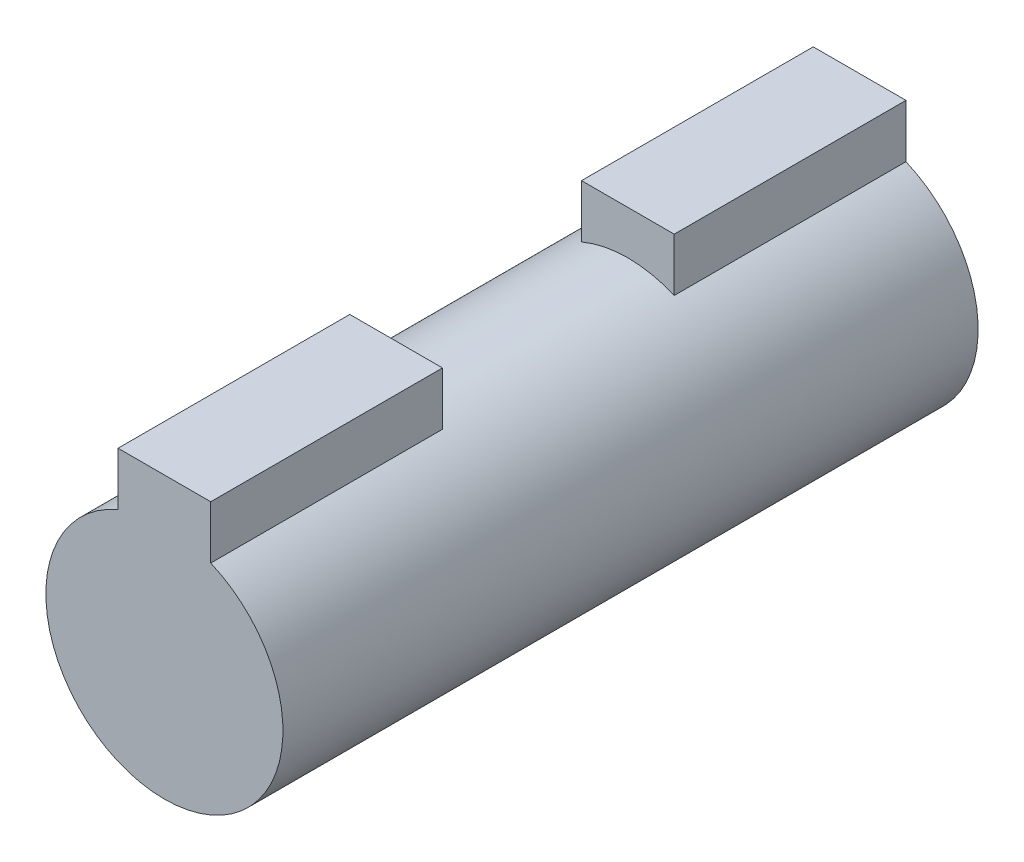
ISO-10303-21;
HEADER;
FILE_DESCRIPTION(('STEP AP214'),'2;1');
FILE_NAME('part.step','',(''),(''),'','','');
FILE_SCHEMA(('AUTOMOTIVE_DESIGN { 1 0 10303 214 1 1 1 1 }'));
ENDSEC;
DATA;
#1=APPLICATION_CONTEXT('core data for automotive mechanical design processes');
#2=APPLICATION_PROTOCOL_DEFINITION('international standard','automotive_design',2000,#1);
#3=PRODUCT_CONTEXT('',#1,'mechanical');
#4=PRODUCT('Part','Part','',(#3));
#5=PRODUCT_RELATED_PRODUCT_CATEGORY('part','',(#4));
#6=PRODUCT_DEFINITION_FORMATION('','',#4);
#7=PRODUCT_DEFINITION_CONTEXT('part definition',#1,'design');
#8=PRODUCT_DEFINITION('design','',#6,#7);
#9=PRODUCT_DEFINITION_SHAPE('','',#8);
#10=(LENGTH_UNIT() NAMED_UNIT(*) SI_UNIT(.MILLI.,.METRE.));
#11=(NAMED_UNIT(*) PLANE_ANGLE_UNIT() SI_UNIT($,.RADIAN.));
#12=(NAMED_UNIT(*) SI_UNIT($,.STERADIAN.) SOLID_ANGLE_UNIT());
#13=UNCERTAINTY_MEASURE_WITH_UNIT(LENGTH_MEASURE(1.E-05),#10,'distance_accuracy_value','');
#14=(GEOMETRIC_REPRESENTATION_CONTEXT(3) GLOBAL_UNCERTAINTY_ASSIGNED_CONTEXT((#13)) GLOBAL_UNIT_ASSIGNED_CONTEXT((#10,
#11,#12)) REPRESENTATION_CONTEXT('',''));
#15=CARTESIAN_POINT('',(0.,0.,0.));
#16=DIRECTION('',(0.,0.,1.));
#17=DIRECTION('',(1.,0.,0.));
#18=AXIS2_PLACEMENT_3D('',#15,#16,#17);
#19=CARTESIAN_POINT('',(-2.,7.,30.));
#20=DIRECTION('',(1.,0.,0.));
#21=DIRECTION('',(0.,1.,0.));
#22=AXIS2_PLACEMENT_3D('',#19,#20,#21);
#23=PLANE('',#22);
#24=DIRECTION('',(0.,-1.,0.));
#25=VECTOR('',#24,1.);
#26=CARTESIAN_POINT('',(-2.,7.,9.99999999999999));
#27=LINE('',#26,#25);
#28=CARTESIAN_POINT('',(-2.,7.,9.99999999999999));
#29=VERTEX_POINT('',#28);
#30=CARTESIAN_POINT('',(-2.,4.70778344871554,10.));
#31=VERTEX_POINT('',#30);
#32=EDGE_CURVE('E157',#29,#31,#27,.T.);
#33=ORIENTED_EDGE('',*,*,#32,.F.);
#34=DIRECTION('',(0.,0.,-1.));
#35=VECTOR('',#34,1.);
#36=CARTESIAN_POINT('',(-2.,7.,30.));
#37=LINE('',#36,#35);
#38=CARTESIAN_POINT('',(-2.,7.,0.));
#39=VERTEX_POINT('',#38);
#40=EDGE_CURVE('E85',#29,#39,#37,.T.);
#41=ORIENTED_EDGE('',*,*,#40,.T.);
#42=DIRECTION('',(0.,-1.,0.));
#43=VECTOR('',#42,1.);
#44=CARTESIAN_POINT('',(-2.,7.,0.));
#45=LINE('',#44,#43);
#46=CARTESIAN_POINT('',(-2.,4.70778344871554,0.));
#47=VERTEX_POINT('',#46);
#48=EDGE_CURVE('E155',#39,#47,#45,.T.);
#49=ORIENTED_EDGE('',*,*,#48,.T.);
#50=DIRECTION('',(0.,0.,-1.));
#51=VECTOR('',#50,1.);
#52=CARTESIAN_POINT('',(-2.,4.70778344871554,30.));
#53=LINE('',#52,#51);
#54=EDGE_CURVE('E131',#31,#47,#53,.T.);
#55=ORIENTED_EDGE('',*,*,#54,.F.);
#56=EDGE_LOOP('',(#33,#41,#49,#55));
#57=FACE_BOUND('',#56,.T.);
#58=ADVANCED_FACE('F39',(#57),#23,.F.);
#59=CARTESIAN_POINT('',(2.,7.,30.));
#60=DIRECTION('',(-1.,0.,0.));
#61=DIRECTION('',(0.,-1.,0.));
#62=AXIS2_PLACEMENT_3D('',#59,#60,#61);
#63=PLANE('',#62);
#64=DIRECTION('',(0.,1.,0.));
#65=VECTOR('',#64,1.);
#66=CARTESIAN_POINT('',(2.,7.,9.99999999999999));
#67=LINE('',#66,#65);
#68=CARTESIAN_POINT('',(2.,4.70778344871554,10.));
#69=VERTEX_POINT('',#68);
#70=CARTESIAN_POINT('',(2.,7.,9.99999999999999));
#71=VERTEX_POINT('',#70);
#72=EDGE_CURVE('E163',#69,#71,#67,.T.);
#73=ORIENTED_EDGE('',*,*,#72,.F.);
#74=DIRECTION('',(0.,0.,-1.));
#75=VECTOR('',#74,1.);
#76=CARTESIAN_POINT('',(2.,4.70778344871554,30.));
#77=LINE('',#76,#75);
#78=CARTESIAN_POINT('',(2.,4.70778344871554,0.));
#79=VERTEX_POINT('',#78);
#80=EDGE_CURVE('E132',#69,#79,#77,.T.);
#81=ORIENTED_EDGE('',*,*,#80,.T.);
#82=DIRECTION('',(0.,1.,0.));
#83=VECTOR('',#82,1.);
#84=CARTESIAN_POINT('',(2.,7.,0.));
#85=LINE('',#84,#83);
#86=CARTESIAN_POINT('',(2.,7.,0.));
#87=VERTEX_POINT('',#86);
#88=EDGE_CURVE('E149',#79,#87,#85,.T.);
#89=ORIENTED_EDGE('',*,*,#88,.T.);
#90=DIRECTION('',(0.,0.,-1.));
#91=VECTOR('',#90,1.);
#92=CARTESIAN_POINT('',(2.,7.,30.));
#93=LINE('',#92,#91);
#94=EDGE_CURVE('E145',#71,#87,#93,.T.);
#95=ORIENTED_EDGE('',*,*,#94,.F.);
#96=EDGE_LOOP('',(#73,#81,#89,#95));
#97=FACE_BOUND('',#96,.T.);
#98=ADVANCED_FACE('F179',(#97),#63,.F.);
#99=CARTESIAN_POINT('',(-2.,7.,30.));
#100=DIRECTION('',(0.,-1.,0.));
#101=DIRECTION('',(0.,0.,-1.));
#102=AXIS2_PLACEMENT_3D('',#99,#100,#101);
#103=PLANE('',#102);
#104=DIRECTION('',(-1.,0.,0.));
#105=VECTOR('',#104,1.);
#106=CARTESIAN_POINT('',(-2.,7.,9.99999999999999));
#107=LINE('',#106,#105);
#108=EDGE_CURVE('E11',#71,#29,#107,.T.);
#109=ORIENTED_EDGE('',*,*,#108,.F.);
#110=ORIENTED_EDGE('',*,*,#94,.T.);
#111=DIRECTION('',(-1.,0.,0.));
#112=VECTOR('',#111,1.);
#113=CARTESIAN_POINT('',(-2.,7.,0.));
#114=LINE('',#113,#112);
#115=EDGE_CURVE('E147',#87,#39,#114,.T.);
#116=ORIENTED_EDGE('',*,*,#115,.T.);
#117=ORIENTED_EDGE('',*,*,#40,.F.);
#118=EDGE_LOOP('',(#109,#110,#116,#117));
#119=FACE_BOUND('',#118,.T.);
#120=ADVANCED_FACE('F183',(#119),#103,.F.);
#121=CARTESIAN_POINT('',(-2.,7.,30.));
#122=VERTEX_POINT('',#121);
#123=CARTESIAN_POINT('',(-2.,7.,20.));
#124=VERTEX_POINT('',#123);
#125=EDGE_CURVE('E141',#122,#124,#37,.T.);
#126=ORIENTED_EDGE('',*,*,#125,.T.);
#127=DIRECTION('',(0.,-1.,0.));
#128=VECTOR('',#127,1.);
#129=CARTESIAN_POINT('',(-2.,7.,20.));
#130=LINE('',#129,#128);
#131=CARTESIAN_POINT('',(-2.,4.70778344871554,20.));
#132=VERTEX_POINT('',#131);
#133=EDGE_CURVE('E54',#124,#132,#130,.T.);
#134=ORIENTED_EDGE('',*,*,#133,.T.);
#135=CARTESIAN_POINT('',(-2.,4.70778344871554,30.));
#136=VERTEX_POINT('',#135);
#137=EDGE_CURVE('E127',#136,#132,#53,.T.);
#138=ORIENTED_EDGE('',*,*,#137,.F.);
#139=DIRECTION('',(0.,-1.,0.));
#140=VECTOR('',#139,1.);
#141=CARTESIAN_POINT('',(-2.,7.,30.));
#142=LINE('',#141,#140);
#143=EDGE_CURVE('E144',#122,#136,#142,.T.);
#144=ORIENTED_EDGE('',*,*,#143,.F.);
#145=EDGE_LOOP('',(#126,#134,#138,#144));
#146=FACE_BOUND('',#145,.T.);
#147=ADVANCED_FACE('F41',(#146),#23,.F.);
#148=CARTESIAN_POINT('',(0.,0.,30.));
#149=DIRECTION('',(0.,0.,-1.));
#150=DIRECTION('',(-1.,0.,0.));
#151=AXIS2_PLACEMENT_3D('',#148,#149,#150);
#152=CYLINDRICAL_SURFACE('',#151,5.115);
#153=ORIENTED_EDGE('',*,*,#137,.T.);
#154=CARTESIAN_POINT('',(0.,0.,20.));
#155=DIRECTION('',(0.,0.,1.));
#156=DIRECTION('',(1.,0.,0.));
#157=AXIS2_PLACEMENT_3D('',#154,#155,#156);
#158=CIRCLE('',#157,5.115);
#159=CARTESIAN_POINT('',(2.,4.70778344871554,20.));
#160=VERTEX_POINT('',#159);
#161=EDGE_CURVE('E115',#160,#132,#158,.T.);
#162=ORIENTED_EDGE('',*,*,#161,.F.);
#163=CARTESIAN_POINT('',(2.,4.70778344871554,30.));
#164=VERTEX_POINT('',#163);
#165=EDGE_CURVE('E124',#164,#160,#77,.T.);
#166=ORIENTED_EDGE('',*,*,#165,.F.);
#167=CARTESIAN_POINT('',(0.,0.,30.));
#168=DIRECTION('',(0.,0.,1.));
#169=DIRECTION('',(1.,0.,0.));
#170=AXIS2_PLACEMENT_3D('',#167,#168,#169);
#171=CIRCLE('',#170,5.115);
#172=EDGE_CURVE('E93',#136,#164,#171,.T.);
#173=ORIENTED_EDGE('',*,*,#172,.F.);
#174=EDGE_LOOP('',(#153,#162,#166,#173));
#175=FACE_BOUND('',#174,.T.);
#176=CARTESIAN_POINT('',(0.,0.,10.));
#177=DIRECTION('',(0.,0.,1.));
#178=DIRECTION('',(1.,0.,0.));
#179=AXIS2_PLACEMENT_3D('',#176,#177,#178);
#180=CIRCLE('',#179,5.115);
#181=EDGE_CURVE('E120',#69,#31,#180,.T.);
#182=ORIENTED_EDGE('',*,*,#181,.T.);
#183=ORIENTED_EDGE('',*,*,#54,.T.);
#184=CARTESIAN_POINT('',(0.,0.,0.));
#185=DIRECTION('',(0.,0.,1.));
#186=DIRECTION('',(1.,0.,0.));
#187=AXIS2_PLACEMENT_3D('',#184,#185,#186);
#188=CIRCLE('',#187,5.115);
#189=EDGE_CURVE('E152',#47,#79,#188,.T.);
#190=ORIENTED_EDGE('',*,*,#189,.T.);
#191=ORIENTED_EDGE('',*,*,#80,.F.);
#192=EDGE_LOOP('',(#182,#183,#190,#191));
#193=FACE_BOUND('',#192,.T.);
#194=ADVANCED_FACE('F122',(#175,#193),#152,.T.);
#195=ORIENTED_EDGE('',*,*,#165,.T.);
#196=DIRECTION('',(0.,1.,0.));
#197=VECTOR('',#196,1.);
#198=CARTESIAN_POINT('',(2.,7.,20.));
#199=LINE('',#198,#197);
#200=CARTESIAN_POINT('',(2.,7.,20.));
#201=VERTEX_POINT('',#200);
#202=EDGE_CURVE('E112',#160,#201,#199,.T.);
#203=ORIENTED_EDGE('',*,*,#202,.T.);
#204=CARTESIAN_POINT('',(2.,7.,30.));
#205=VERTEX_POINT('',#204);
#206=EDGE_CURVE('E135',#205,#201,#93,.T.);
#207=ORIENTED_EDGE('',*,*,#206,.F.);
#208=DIRECTION('',(0.,1.,0.));
#209=VECTOR('',#208,1.);
#210=CARTESIAN_POINT('',(2.,7.,30.));
#211=LINE('',#210,#209);
#212=EDGE_CURVE('E130',#164,#205,#211,.T.);
#213=ORIENTED_EDGE('',*,*,#212,.F.);
#214=EDGE_LOOP('',(#195,#203,#207,#213));
#215=FACE_BOUND('',#214,.T.);
#216=ADVANCED_FACE('F129',(#215),#63,.F.);
#217=ORIENTED_EDGE('',*,*,#206,.T.);
#218=DIRECTION('',(-1.,0.,0.));
#219=VECTOR('',#218,1.);
#220=CARTESIAN_POINT('',(-2.,7.,20.));
#221=LINE('',#220,#219);
#222=EDGE_CURVE('E47',#201,#124,#221,.T.);
#223=ORIENTED_EDGE('',*,*,#222,.T.);
#224=ORIENTED_EDGE('',*,*,#125,.F.);
#225=DIRECTION('',(-1.,0.,0.));
#226=VECTOR('',#225,1.);
#227=CARTESIAN_POINT('',(-2.,7.,30.));
#228=LINE('',#227,#226);
#229=EDGE_CURVE('E63',#205,#122,#228,.T.);
#230=ORIENTED_EDGE('',*,*,#229,.F.);
#231=EDGE_LOOP('',(#217,#223,#224,#230));
#232=FACE_BOUND('',#231,.T.);
#233=ADVANCED_FACE('F140',(#232),#103,.F.);
#234=CARTESIAN_POINT('',(0.,0.,30.));
#235=DIRECTION('',(0.,0.,1.));
#236=DIRECTION('',(1.,0.,0.));
#237=AXIS2_PLACEMENT_3D('',#234,#235,#236);
#238=PLANE('',#237);
#239=ORIENTED_EDGE('',*,*,#143,.T.);
#240=ORIENTED_EDGE('',*,*,#172,.T.);
#241=ORIENTED_EDGE('',*,*,#212,.T.);
#242=ORIENTED_EDGE('',*,*,#229,.T.);
#243=EDGE_LOOP('',(#239,#240,#241,#242));
#244=FACE_BOUND('',#243,.T.);
#245=ADVANCED_FACE('F193',(#244),#238,.T.);
#246=CARTESIAN_POINT('',(0.,0.,0.));
#247=DIRECTION('',(0.,0.,1.));
#248=DIRECTION('',(1.,0.,0.));
#249=AXIS2_PLACEMENT_3D('',#246,#247,#248);
#250=PLANE('',#249);
#251=ORIENTED_EDGE('',*,*,#48,.F.);
#252=ORIENTED_EDGE('',*,*,#115,.F.);
#253=ORIENTED_EDGE('',*,*,#88,.F.);
#254=ORIENTED_EDGE('',*,*,#189,.F.);
#255=EDGE_LOOP('',(#251,#252,#253,#254));
#256=FACE_BOUND('',#255,.T.);
#257=ADVANCED_FACE('F175',(#256),#250,.F.);
#258=CARTESIAN_POINT('',(0.,0.,10.));
#259=DIRECTION('',(0.,0.,1.));
#260=DIRECTION('',(1.,0.,0.));
#261=AXIS2_PLACEMENT_3D('',#258,#259,#260);
#262=PLANE('',#261);
#263=ORIENTED_EDGE('',*,*,#32,.T.);
#264=ORIENTED_EDGE('',*,*,#181,.F.);
#265=ORIENTED_EDGE('',*,*,#72,.T.);
#266=ORIENTED_EDGE('',*,*,#108,.T.);
#267=EDGE_LOOP('',(#263,#264,#265,#266));
#268=FACE_BOUND('',#267,.T.);
#269=ADVANCED_FACE('F181',(#268),#262,.T.);
#270=CARTESIAN_POINT('',(0.,0.,20.));
#271=DIRECTION('',(0.,0.,1.));
#272=DIRECTION('',(1.,0.,0.));
#273=AXIS2_PLACEMENT_3D('',#270,#271,#272);
#274=PLANE('',#273);
#275=ORIENTED_EDGE('',*,*,#222,.F.);
#276=ORIENTED_EDGE('',*,*,#202,.F.);
#277=ORIENTED_EDGE('',*,*,#161,.T.);
#278=ORIENTED_EDGE('',*,*,#133,.F.);
#279=EDGE_LOOP('',(#275,#276,#277,#278));
#280=FACE_BOUND('',#279,.T.);
#281=ADVANCED_FACE('F114',(#280),#274,.F.);
#282=CLOSED_SHELL('',(#58,#98,#120,#147,#194,#216,#233,#245,#257,#269,#281));
#283=MANIFOLD_SOLID_BREP('B2',#282);
#284=ADVANCED_BREP_SHAPE_REPRESENTATION('',(#18,#283),#14);
#285=SHAPE_DEFINITION_REPRESENTATION(#9,#284);
ENDSEC;
END-ISO-10303-21;
